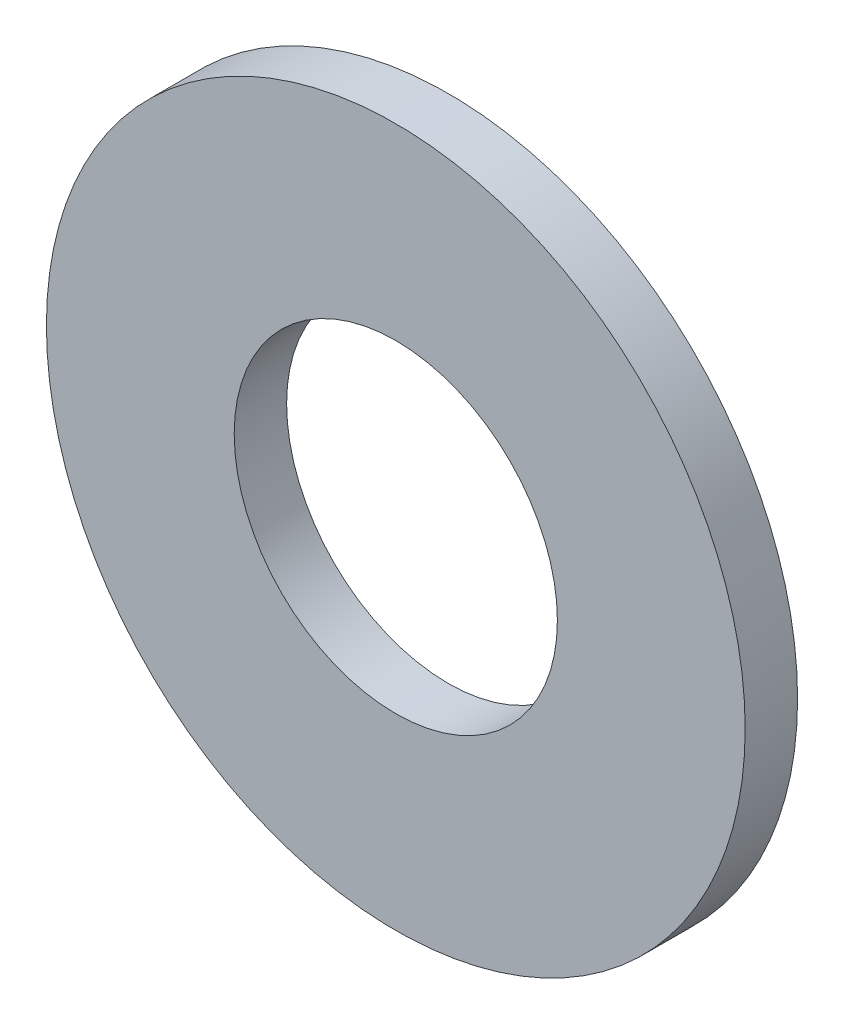
ISO-10303-21;
HEADER;
FILE_DESCRIPTION(('STEP AP214'),'2;1');
FILE_NAME('part.step','',(''),(''),'','','');
FILE_SCHEMA(('AUTOMOTIVE_DESIGN { 1 0 10303 214 1 1 1 1 }'));
ENDSEC;
DATA;
#1=APPLICATION_CONTEXT('core data for automotive mechanical design processes');
#2=APPLICATION_PROTOCOL_DEFINITION('international standard','automotive_design',2000,#1);
#3=PRODUCT_CONTEXT('',#1,'mechanical');
#4=PRODUCT('Part','Part','',(#3));
#5=PRODUCT_RELATED_PRODUCT_CATEGORY('part','',(#4));
#6=PRODUCT_DEFINITION_FORMATION('','',#4);
#7=PRODUCT_DEFINITION_CONTEXT('part definition',#1,'design');
#8=PRODUCT_DEFINITION('design','',#6,#7);
#9=PRODUCT_DEFINITION_SHAPE('','',#8);
#10=(LENGTH_UNIT() NAMED_UNIT(*) SI_UNIT(.MILLI.,.METRE.));
#11=(NAMED_UNIT(*) PLANE_ANGLE_UNIT() SI_UNIT($,.RADIAN.));
#12=(NAMED_UNIT(*) SI_UNIT($,.STERADIAN.) SOLID_ANGLE_UNIT());
#13=UNCERTAINTY_MEASURE_WITH_UNIT(LENGTH_MEASURE(1.E-05),#10,'distance_accuracy_value','');
#14=(GEOMETRIC_REPRESENTATION_CONTEXT(3) GLOBAL_UNCERTAINTY_ASSIGNED_CONTEXT((#13)) GLOBAL_UNIT_ASSIGNED_CONTEXT((#10,
#11,#12)) REPRESENTATION_CONTEXT('',''));
#15=CARTESIAN_POINT('',(0.,0.,0.));
#16=DIRECTION('',(0.,0.,1.));
#17=DIRECTION('',(1.,0.,0.));
#18=AXIS2_PLACEMENT_3D('',#15,#16,#17);
#19=CARTESIAN_POINT('',(0.,0.,3.));
#20=DIRECTION('',(0.,0.,1.));
#21=DIRECTION('',(1.,0.,0.));
#22=AXIS2_PLACEMENT_3D('',#19,#20,#21);
#23=PLANE('',#22);
#24=CARTESIAN_POINT('',(0.,0.,3.));
#25=DIRECTION('',(0.,0.,1.));
#26=DIRECTION('',(1.,0.,0.));
#27=AXIS2_PLACEMENT_3D('',#24,#25,#26);
#28=CIRCLE('',#27,20.);
#29=CARTESIAN_POINT('',(20.,0.,3.));
#30=VERTEX_POINT('',#29);
#31=EDGE_CURVE('E10',#30,#30,#28,.T.);
#32=ORIENTED_EDGE('',*,*,#31,.T.);
#33=EDGE_LOOP('',(#32));
#34=FACE_BOUND('',#33,.T.);
#35=CARTESIAN_POINT('',(0.,0.,3.));
#36=DIRECTION('',(0.,0.,1.));
#37=DIRECTION('',(1.,0.,0.));
#38=AXIS2_PLACEMENT_3D('',#35,#36,#37);
#39=CIRCLE('',#38,9.25);
#40=CARTESIAN_POINT('',(9.25,0.,3.));
#41=VERTEX_POINT('',#40);
#42=EDGE_CURVE('E53',#41,#41,#39,.T.);
#43=ORIENTED_EDGE('',*,*,#42,.F.);
#44=EDGE_LOOP('',(#43));
#45=FACE_BOUND('',#44,.T.);
#46=ADVANCED_FACE('F40',(#34,#45),#23,.T.);
#47=CARTESIAN_POINT('',(0.,0.,0.));
#48=DIRECTION('',(0.,0.,1.));
#49=DIRECTION('',(1.,0.,0.));
#50=AXIS2_PLACEMENT_3D('',#47,#48,#49);
#51=PLANE('',#50);
#52=CARTESIAN_POINT('',(0.,0.,0.));
#53=DIRECTION('',(0.,0.,1.));
#54=DIRECTION('',(1.,0.,0.));
#55=AXIS2_PLACEMENT_3D('',#52,#53,#54);
#56=CIRCLE('',#55,20.);
#57=CARTESIAN_POINT('',(20.,0.,0.));
#58=VERTEX_POINT('',#57);
#59=EDGE_CURVE('E44',#58,#58,#56,.T.);
#60=ORIENTED_EDGE('',*,*,#59,.F.);
#61=EDGE_LOOP('',(#60));
#62=FACE_BOUND('',#61,.T.);
#63=CARTESIAN_POINT('',(0.,0.,0.));
#64=DIRECTION('',(0.,0.,1.));
#65=DIRECTION('',(1.,0.,0.));
#66=AXIS2_PLACEMENT_3D('',#63,#64,#65);
#67=CIRCLE('',#66,9.25);
#68=CARTESIAN_POINT('',(9.25,0.,0.));
#69=VERTEX_POINT('',#68);
#70=EDGE_CURVE('E55',#69,#69,#67,.T.);
#71=ORIENTED_EDGE('',*,*,#70,.T.);
#72=EDGE_LOOP('',(#71));
#73=FACE_BOUND('',#72,.T.);
#74=ADVANCED_FACE('F67',(#62,#73),#51,.F.);
#75=CARTESIAN_POINT('',(0.,0.,3.));
#76=DIRECTION('',(0.,0.,-1.));
#77=DIRECTION('',(-1.,0.,0.));
#78=AXIS2_PLACEMENT_3D('',#75,#76,#77);
#79=CYLINDRICAL_SURFACE('',#78,20.);
#80=ORIENTED_EDGE('',*,*,#31,.F.);
#81=EDGE_LOOP('',(#80));
#82=FACE_BOUND('',#81,.T.);
#83=ORIENTED_EDGE('',*,*,#59,.T.);
#84=EDGE_LOOP('',(#83));
#85=FACE_BOUND('',#84,.T.);
#86=ADVANCED_FACE('F42',(#82,#85),#79,.T.);
#87=CARTESIAN_POINT('',(0.,0.,3.));
#88=DIRECTION('',(0.,0.,-1.));
#89=DIRECTION('',(-1.,0.,0.));
#90=AXIS2_PLACEMENT_3D('',#87,#88,#89);
#91=CYLINDRICAL_SURFACE('',#90,9.25);
#92=ORIENTED_EDGE('',*,*,#42,.T.);
#93=EDGE_LOOP('',(#92));
#94=FACE_BOUND('',#93,.T.);
#95=ORIENTED_EDGE('',*,*,#70,.F.);
#96=EDGE_LOOP('',(#95));
#97=FACE_BOUND('',#96,.T.);
#98=ADVANCED_FACE('F63',(#94,#97),#91,.F.);
#99=CLOSED_SHELL('',(#46,#74,#86,#98));
#100=MANIFOLD_SOLID_BREP('B2',#99);
#101=ADVANCED_BREP_SHAPE_REPRESENTATION('',(#18,#100),#14);
#102=SHAPE_DEFINITION_REPRESENTATION(#9,#101);
ENDSEC;
END-ISO-10303-21;
